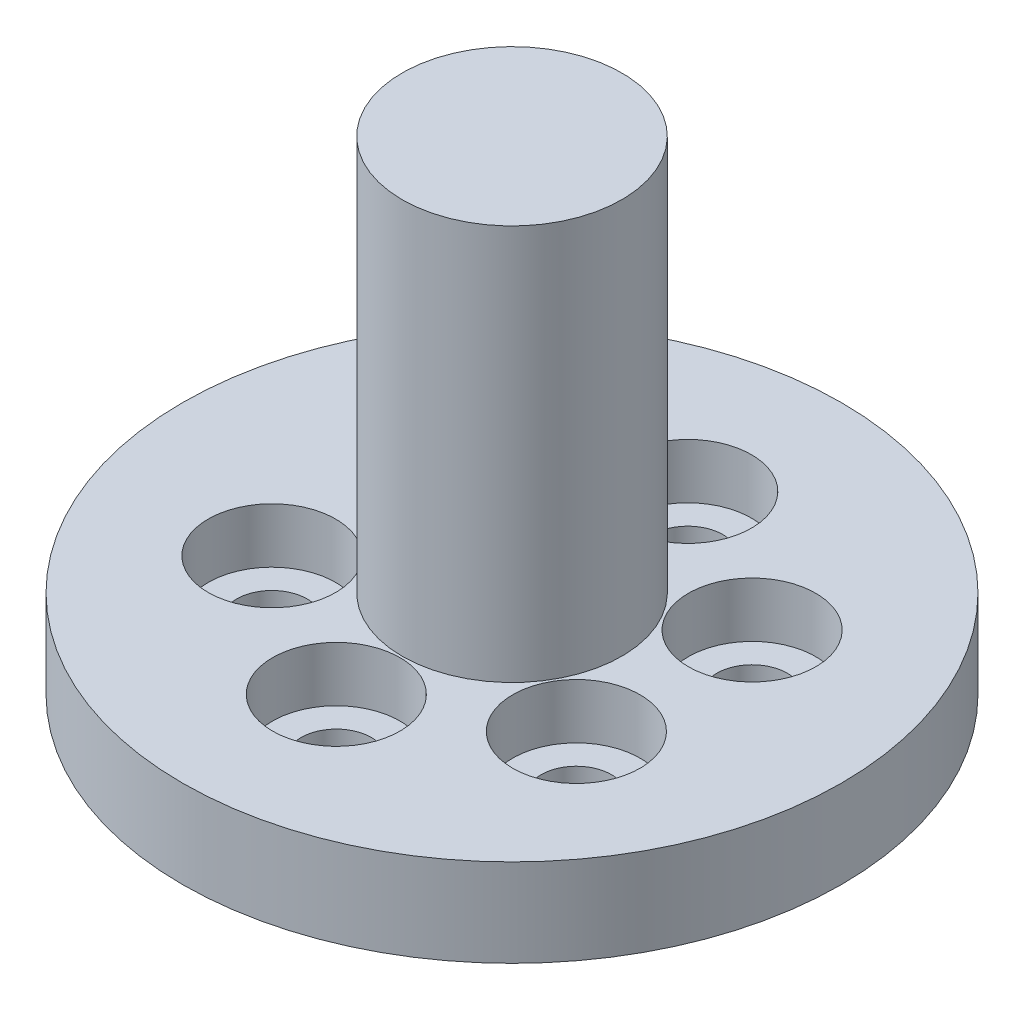
ISO-10303-21;
HEADER;
FILE_DESCRIPTION(('STEP AP214'),'2;1');
FILE_NAME('part.step','',(''),(''),'','','');
FILE_SCHEMA(('AUTOMOTIVE_DESIGN { 1 0 10303 214 1 1 1 1 }'));
ENDSEC;
DATA;
#1=APPLICATION_CONTEXT('core data for automotive mechanical design processes');
#2=APPLICATION_PROTOCOL_DEFINITION('international standard','automotive_design',2000,#1);
#3=PRODUCT_CONTEXT('',#1,'mechanical');
#4=PRODUCT('Part','Part','',(#3));
#5=PRODUCT_RELATED_PRODUCT_CATEGORY('part','',(#4));
#6=PRODUCT_DEFINITION_FORMATION('','',#4);
#7=PRODUCT_DEFINITION_CONTEXT('part definition',#1,'design');
#8=PRODUCT_DEFINITION('design','',#6,#7);
#9=PRODUCT_DEFINITION_SHAPE('','',#8);
#10=(LENGTH_UNIT() NAMED_UNIT(*) SI_UNIT(.MILLI.,.METRE.));
#11=(NAMED_UNIT(*) PLANE_ANGLE_UNIT() SI_UNIT($,.RADIAN.));
#12=(NAMED_UNIT(*) SI_UNIT($,.STERADIAN.) SOLID_ANGLE_UNIT());
#13=UNCERTAINTY_MEASURE_WITH_UNIT(LENGTH_MEASURE(1.E-05),#10,'distance_accuracy_value','');
#14=(GEOMETRIC_REPRESENTATION_CONTEXT(3) GLOBAL_UNCERTAINTY_ASSIGNED_CONTEXT((#13)) GLOBAL_UNIT_ASSIGNED_CONTEXT((#10,
#11,#12)) REPRESENTATION_CONTEXT('',''));
#15=CARTESIAN_POINT('',(0.,0.,0.));
#16=DIRECTION('',(0.,0.,1.));
#17=DIRECTION('',(1.,0.,0.));
#18=AXIS2_PLACEMENT_3D('',#15,#16,#17);
#19=CARTESIAN_POINT('',(6.92820323027568,-1.,-4.0000000000003));
#20=DIRECTION('',(0.,1.,0.));
#21=DIRECTION('',(0.,0.,1.));
#22=AXIS2_PLACEMENT_3D('',#19,#20,#21);
#23=CYLINDRICAL_SURFACE('',#22,1.6000000000001);
#24=CARTESIAN_POINT('',(6.92820323027568,0.,-4.0000000000003));
#25=DIRECTION('',(0.,1.,0.));
#26=DIRECTION('',(0.,0.,1.));
#27=AXIS2_PLACEMENT_3D('',#24,#25,#26);
#28=CIRCLE('',#27,1.6000000000001);
#29=CARTESIAN_POINT('',(6.92820323027568,0.,-2.4000000000002));
#30=VERTEX_POINT('',#29);
#31=EDGE_CURVE('E56',#30,#30,#28,.T.);
#32=ORIENTED_EDGE('',*,*,#31,.F.);
#33=EDGE_LOOP('',(#32));
#34=FACE_BOUND('',#33,.T.);
#35=CARTESIAN_POINT('',(6.92820323027568,1.5,-4.0000000000003));
#36=DIRECTION('',(0.,1.,0.));
#37=DIRECTION('',(0.,0.,1.));
#38=AXIS2_PLACEMENT_3D('',#35,#36,#37);
#39=CIRCLE('',#38,1.6000000000001);
#40=CARTESIAN_POINT('',(6.92820323027568,1.5,-2.4000000000002));
#41=VERTEX_POINT('',#40);
#42=EDGE_CURVE('E41',#41,#41,#39,.F.);
#43=ORIENTED_EDGE('',*,*,#42,.F.);
#44=EDGE_LOOP('',(#43));
#45=FACE_BOUND('',#44,.T.);
#46=ADVANCED_FACE('F37',(#34,#45),#23,.F.);
#47=CARTESIAN_POINT('',(6.92820323027602,-1.,3.9999999999997));
#48=DIRECTION('',(0.,1.,0.));
#49=DIRECTION('',(0.,0.,1.));
#50=AXIS2_PLACEMENT_3D('',#47,#48,#49);
#51=CYLINDRICAL_SURFACE('',#50,1.60000000000044);
#52=CARTESIAN_POINT('',(6.92820323027602,0.,3.9999999999997));
#53=DIRECTION('',(0.,1.,0.));
#54=DIRECTION('',(0.,0.,1.));
#55=AXIS2_PLACEMENT_3D('',#52,#53,#54);
#56=CIRCLE('',#55,1.60000000000044);
#57=CARTESIAN_POINT('',(6.92820323027602,0.,5.60000000000014));
#58=VERTEX_POINT('',#57);
#59=EDGE_CURVE('E59',#58,#58,#56,.T.);
#60=ORIENTED_EDGE('',*,*,#59,.F.);
#61=EDGE_LOOP('',(#60));
#62=FACE_BOUND('',#61,.T.);
#63=CARTESIAN_POINT('',(6.92820323027602,1.5,3.9999999999997));
#64=DIRECTION('',(0.,1.,0.));
#65=DIRECTION('',(0.,0.,1.));
#66=AXIS2_PLACEMENT_3D('',#63,#64,#65);
#67=CIRCLE('',#66,1.60000000000044);
#68=CARTESIAN_POINT('',(6.92820323027602,1.5,5.60000000000014));
#69=VERTEX_POINT('',#68);
#70=EDGE_CURVE('E85',#69,#69,#67,.F.);
#71=ORIENTED_EDGE('',*,*,#70,.F.);
#72=EDGE_LOOP('',(#71));
#73=FACE_BOUND('',#72,.T.);
#74=ADVANCED_FACE('F95',(#62,#73),#51,.F.);
#75=CARTESIAN_POINT('',(6.79181874011743E-13,-1.,8.));
#76=DIRECTION('',(0.,1.,0.));
#77=DIRECTION('',(0.,0.,1.));
#78=AXIS2_PLACEMENT_3D('',#75,#76,#77);
#79=CYLINDRICAL_SURFACE('',#78,1.6000000000007);
#80=CARTESIAN_POINT('',(6.79181874011743E-13,0.,8.));
#81=DIRECTION('',(0.,1.,0.));
#82=DIRECTION('',(0.,0.,1.));
#83=AXIS2_PLACEMENT_3D('',#80,#81,#82);
#84=CIRCLE('',#83,1.6000000000007);
#85=CARTESIAN_POINT('',(6.79181874011743E-13,0.,9.6000000000007));
#86=VERTEX_POINT('',#85);
#87=EDGE_CURVE('E62',#86,#86,#84,.T.);
#88=ORIENTED_EDGE('',*,*,#87,.F.);
#89=EDGE_LOOP('',(#88));
#90=FACE_BOUND('',#89,.T.);
#91=CARTESIAN_POINT('',(6.79181874011743E-13,1.5,8.));
#92=DIRECTION('',(0.,1.,0.));
#93=DIRECTION('',(0.,0.,1.));
#94=AXIS2_PLACEMENT_3D('',#91,#92,#93);
#95=CIRCLE('',#94,1.6000000000007);
#96=CARTESIAN_POINT('',(6.79181874011743E-13,1.5,9.6000000000007));
#97=VERTEX_POINT('',#96);
#98=EDGE_CURVE('E83',#97,#97,#95,.F.);
#99=ORIENTED_EDGE('',*,*,#98,.F.);
#100=EDGE_LOOP('',(#99));
#101=FACE_BOUND('',#100,.T.);
#102=ADVANCED_FACE('F101',(#90,#101),#79,.F.);
#103=CARTESIAN_POINT('',(-6.928203230275,-1.,4.0000000000003));
#104=DIRECTION('',(0.,1.,0.));
#105=DIRECTION('',(0.,0.,1.));
#106=AXIS2_PLACEMENT_3D('',#103,#104,#105);
#107=CYLINDRICAL_SURFACE('',#106,1.60000000000065);
#108=CARTESIAN_POINT('',(-6.928203230275,0.,4.0000000000003));
#109=DIRECTION('',(0.,1.,0.));
#110=DIRECTION('',(0.,0.,1.));
#111=AXIS2_PLACEMENT_3D('',#108,#109,#110);
#112=CIRCLE('',#111,1.60000000000065);
#113=CARTESIAN_POINT('',(-6.928203230275,0.,5.60000000000095));
#114=VERTEX_POINT('',#113);
#115=EDGE_CURVE('E65',#114,#114,#112,.T.);
#116=ORIENTED_EDGE('',*,*,#115,.F.);
#117=EDGE_LOOP('',(#116));
#118=FACE_BOUND('',#117,.T.);
#119=CARTESIAN_POINT('',(-6.928203230275,1.5,4.0000000000003));
#120=DIRECTION('',(0.,1.,0.));
#121=DIRECTION('',(0.,0.,1.));
#122=AXIS2_PLACEMENT_3D('',#119,#120,#121);
#123=CIRCLE('',#122,1.60000000000065);
#124=CARTESIAN_POINT('',(-6.928203230275,1.5,5.60000000000095));
#125=VERTEX_POINT('',#124);
#126=EDGE_CURVE('E80',#125,#125,#123,.F.);
#127=ORIENTED_EDGE('',*,*,#126,.F.);
#128=EDGE_LOOP('',(#127));
#129=FACE_BOUND('',#128,.T.);
#130=ADVANCED_FACE('F111',(#118,#129),#107,.F.);
#131=CARTESIAN_POINT('',(-6.92820323027534,-1.,-3.9999999999997));
#132=DIRECTION('',(0.,1.,0.));
#133=DIRECTION('',(0.,0.,1.));
#134=AXIS2_PLACEMENT_3D('',#131,#132,#133);
#135=CYLINDRICAL_SURFACE('',#134,1.60000000000034);
#136=CARTESIAN_POINT('',(-6.92820323027534,0.,-3.9999999999997));
#137=DIRECTION('',(0.,1.,0.));
#138=DIRECTION('',(0.,0.,1.));
#139=AXIS2_PLACEMENT_3D('',#136,#137,#138);
#140=CIRCLE('',#139,1.60000000000034);
#141=CARTESIAN_POINT('',(-6.92820323027534,0.,-2.39999999999936));
#142=VERTEX_POINT('',#141);
#143=EDGE_CURVE('E68',#142,#142,#140,.T.);
#144=ORIENTED_EDGE('',*,*,#143,.F.);
#145=EDGE_LOOP('',(#144));
#146=FACE_BOUND('',#145,.T.);
#147=CARTESIAN_POINT('',(-6.92820323027534,1.5,-3.9999999999997));
#148=DIRECTION('',(0.,1.,0.));
#149=DIRECTION('',(0.,0.,1.));
#150=AXIS2_PLACEMENT_3D('',#147,#148,#149);
#151=CIRCLE('',#150,1.60000000000034);
#152=CARTESIAN_POINT('',(-6.92820323027534,1.5,-2.39999999999936));
#153=VERTEX_POINT('',#152);
#154=EDGE_CURVE('E76',#153,#153,#151,.F.);
#155=ORIENTED_EDGE('',*,*,#154,.F.);
#156=EDGE_LOOP('',(#155));
#157=FACE_BOUND('',#156,.T.);
#158=ADVANCED_FACE('F106',(#146,#157),#135,.F.);
#159=CARTESIAN_POINT('',(0.,-1.,-8.));
#160=DIRECTION('',(0.,1.,0.));
#161=DIRECTION('',(0.,0.,1.));
#162=AXIS2_PLACEMENT_3D('',#159,#160,#161);
#163=CYLINDRICAL_SURFACE('',#162,1.6);
#164=CARTESIAN_POINT('',(0.,0.,-8.));
#165=DIRECTION('',(0.,1.,0.));
#166=DIRECTION('',(0.,0.,1.));
#167=AXIS2_PLACEMENT_3D('',#164,#165,#166);
#168=CIRCLE('',#167,1.6);
#169=CARTESIAN_POINT('',(0.,0.,-6.4));
#170=VERTEX_POINT('',#169);
#171=EDGE_CURVE('E50',#170,#170,#168,.T.);
#172=ORIENTED_EDGE('',*,*,#171,.F.);
#173=EDGE_LOOP('',(#172));
#174=FACE_BOUND('',#173,.T.);
#175=CARTESIAN_POINT('',(0.,1.5,-8.));
#176=DIRECTION('',(0.,1.,0.));
#177=DIRECTION('',(0.,0.,1.));
#178=AXIS2_PLACEMENT_3D('',#175,#176,#177);
#179=CIRCLE('',#178,1.6);
#180=CARTESIAN_POINT('',(0.,1.5,-6.4));
#181=VERTEX_POINT('',#180);
#182=EDGE_CURVE('E73',#181,#181,#179,.F.);
#183=ORIENTED_EDGE('',*,*,#182,.F.);
#184=EDGE_LOOP('',(#183));
#185=FACE_BOUND('',#184,.T.);
#186=ADVANCED_FACE('F147',(#174,#185),#163,.F.);
#187=CARTESIAN_POINT('',(0.,4.,0.));
#188=DIRECTION('',(0.,-1.,0.));
#189=DIRECTION('',(0.,0.,-1.));
#190=AXIS2_PLACEMENT_3D('',#187,#188,#189);
#191=CYLINDRICAL_SURFACE('',#190,15.);
#192=CARTESIAN_POINT('',(0.,4.,0.));
#193=DIRECTION('',(0.,1.,0.));
#194=DIRECTION('',(0.,0.,1.));
#195=AXIS2_PLACEMENT_3D('',#192,#193,#194);
#196=CIRCLE('',#195,15.);
#197=CARTESIAN_POINT('',(0.,4.,15.));
#198=VERTEX_POINT('',#197);
#199=EDGE_CURVE('E10',#198,#198,#196,.T.);
#200=ORIENTED_EDGE('',*,*,#199,.F.);
#201=EDGE_LOOP('',(#200));
#202=FACE_BOUND('',#201,.T.);
#203=CARTESIAN_POINT('',(0.,0.,0.));
#204=DIRECTION('',(0.,1.,0.));
#205=DIRECTION('',(0.,0.,1.));
#206=AXIS2_PLACEMENT_3D('',#203,#204,#205);
#207=CIRCLE('',#206,15.);
#208=CARTESIAN_POINT('',(0.,0.,15.));
#209=VERTEX_POINT('',#208);
#210=EDGE_CURVE('E45',#209,#209,#207,.T.);
#211=ORIENTED_EDGE('',*,*,#210,.T.);
#212=EDGE_LOOP('',(#211));
#213=FACE_BOUND('',#212,.T.);
#214=ADVANCED_FACE('F39',(#202,#213),#191,.T.);
#215=CARTESIAN_POINT('',(0.,4.,0.));
#216=DIRECTION('',(0.,1.,0.));
#217=DIRECTION('',(0.,0.,1.));
#218=AXIS2_PLACEMENT_3D('',#215,#216,#217);
#219=PLANE('',#218);
#220=CARTESIAN_POINT('',(0.,4.,0.));
#221=DIRECTION('',(0.,1.,0.));
#222=DIRECTION('',(0.,0.,1.));
#223=AXIS2_PLACEMENT_3D('',#220,#221,#222);
#224=CIRCLE('',#223,5.);
#225=CARTESIAN_POINT('',(0.,4.,5.));
#226=VERTEX_POINT('',#225);
#227=EDGE_CURVE('E221',#226,#226,#224,.T.);
#228=ORIENTED_EDGE('',*,*,#227,.F.);
#229=EDGE_LOOP('',(#228));
#230=FACE_BOUND('',#229,.T.);
#231=CARTESIAN_POINT('',(6.92870323027552,4.,-4.00086602540377));
#232=DIRECTION('',(0.,1.,0.));
#233=DIRECTION('',(0.,0.,1.));
#234=AXIS2_PLACEMENT_3D('',#231,#232,#233);
#235=CIRCLE('',#234,2.9);
#236=CARTESIAN_POINT('',(6.92870323027552,4.,-1.10086602540377));
#237=VERTEX_POINT('',#236);
#238=EDGE_CURVE('E240',#237,#237,#235,.T.);
#239=ORIENTED_EDGE('',*,*,#238,.F.);
#240=EDGE_LOOP('',(#239));
#241=FACE_BOUND('',#240,.T.);
#242=CARTESIAN_POINT('',(6.92970323027549,4.,3.99913397459625));
#243=DIRECTION('',(0.,1.,0.));
#244=DIRECTION('',(0.,0.,1.));
#245=AXIS2_PLACEMENT_3D('',#242,#243,#244);
#246=CIRCLE('',#245,2.9);
#247=CARTESIAN_POINT('',(6.92970323027549,4.,6.89913397459625));
#248=VERTEX_POINT('',#247);
#249=EDGE_CURVE('E246',#248,#248,#246,.T.);
#250=ORIENTED_EDGE('',*,*,#249,.F.);
#251=EDGE_LOOP('',(#250));
#252=FACE_BOUND('',#251,.T.);
#253=CARTESIAN_POINT('',(0.00199999999994414,4.,8.));
#254=DIRECTION('',(0.,1.,0.));
#255=DIRECTION('',(0.,0.,1.));
#256=AXIS2_PLACEMENT_3D('',#253,#254,#255);
#257=CIRCLE('',#256,2.9);
#258=CARTESIAN_POINT('',(0.00199999999994414,4.,10.9));
#259=VERTEX_POINT('',#258);
#260=EDGE_CURVE('E252',#259,#259,#257,.T.);
#261=ORIENTED_EDGE('',*,*,#260,.F.);
#262=EDGE_LOOP('',(#261));
#263=FACE_BOUND('',#262,.T.);
#264=CARTESIAN_POINT('',(-6.92670323027555,4.,4.00086602540372));
#265=DIRECTION('',(0.,1.,0.));
#266=DIRECTION('',(0.,0.,1.));
#267=AXIS2_PLACEMENT_3D('',#264,#265,#266);
#268=CIRCLE('',#267,2.9);
#269=CARTESIAN_POINT('',(-6.92670323027555,4.,6.90086602540372));
#270=VERTEX_POINT('',#269);
#271=EDGE_CURVE('E234',#270,#270,#268,.T.);
#272=ORIENTED_EDGE('',*,*,#271,.F.);
#273=EDGE_LOOP('',(#272));
#274=FACE_BOUND('',#273,.T.);
#275=CARTESIAN_POINT('',(-6.92770323027546,4.,-3.9991339745963));
#276=DIRECTION('',(0.,1.,0.));
#277=DIRECTION('',(0.,0.,1.));
#278=AXIS2_PLACEMENT_3D('',#275,#276,#277);
#279=CIRCLE('',#278,2.9);
#280=CARTESIAN_POINT('',(-6.92770323027546,4.,-1.0991339745963));
#281=VERTEX_POINT('',#280);
#282=EDGE_CURVE('E229',#281,#281,#279,.T.);
#283=ORIENTED_EDGE('',*,*,#282,.F.);
#284=EDGE_LOOP('',(#283));
#285=FACE_BOUND('',#284,.T.);
#286=CARTESIAN_POINT('',(0.,4.,-8.));
#287=DIRECTION('',(0.,1.,0.));
#288=DIRECTION('',(0.,0.,1.));
#289=AXIS2_PLACEMENT_3D('',#286,#287,#288);
#290=CIRCLE('',#289,2.9);
#291=CARTESIAN_POINT('',(0.,4.,-5.1));
#292=VERTEX_POINT('',#291);
#293=EDGE_CURVE('E53',#292,#292,#290,.T.);
#294=ORIENTED_EDGE('',*,*,#293,.F.);
#295=EDGE_LOOP('',(#294));
#296=FACE_BOUND('',#295,.T.);
#297=ORIENTED_EDGE('',*,*,#199,.T.);
#298=EDGE_LOOP('',(#297));
#299=FACE_BOUND('',#298,.T.);
#300=ADVANCED_FACE('F116',(#230,#241,#252,#263,#274,#285,#296,#299),#219,.T.);
#301=CARTESIAN_POINT('',(0.,0.,0.));
#302=DIRECTION('',(0.,1.,0.));
#303=DIRECTION('',(0.,0.,1.));
#304=AXIS2_PLACEMENT_3D('',#301,#302,#303);
#305=PLANE('',#304);
#306=CARTESIAN_POINT('',(0.,0.,0.));
#307=DIRECTION('',(0.,-1.,0.));
#308=DIRECTION('',(0.,0.,-1.));
#309=AXIS2_PLACEMENT_3D('',#306,#307,#308);
#310=CIRCLE('',#309,4.);
#311=CARTESIAN_POINT('',(0.,0.,-4.));
#312=VERTEX_POINT('',#311);
#313=EDGE_CURVE('E132',#312,#312,#310,.T.);
#314=ORIENTED_EDGE('',*,*,#313,.F.);
#315=EDGE_LOOP('',(#314));
#316=FACE_BOUND('',#315,.T.);
#317=ORIENTED_EDGE('',*,*,#171,.T.);
#318=EDGE_LOOP('',(#317));
#319=FACE_BOUND('',#318,.T.);
#320=ORIENTED_EDGE('',*,*,#143,.T.);
#321=EDGE_LOOP('',(#320));
#322=FACE_BOUND('',#321,.T.);
#323=ORIENTED_EDGE('',*,*,#115,.T.);
#324=EDGE_LOOP('',(#323));
#325=FACE_BOUND('',#324,.T.);
#326=ORIENTED_EDGE('',*,*,#87,.T.);
#327=EDGE_LOOP('',(#326));
#328=FACE_BOUND('',#327,.T.);
#329=ORIENTED_EDGE('',*,*,#59,.T.);
#330=EDGE_LOOP('',(#329));
#331=FACE_BOUND('',#330,.T.);
#332=ORIENTED_EDGE('',*,*,#31,.T.);
#333=EDGE_LOOP('',(#332));
#334=FACE_BOUND('',#333,.T.);
#335=ORIENTED_EDGE('',*,*,#210,.F.);
#336=EDGE_LOOP('',(#335));
#337=FACE_BOUND('',#336,.T.);
#338=ADVANCED_FACE('F118',(#316,#319,#322,#325,#328,#331,#334,#337),#305,.F.);
#339=CARTESIAN_POINT('',(0.,1.5,-8.));
#340=DIRECTION('',(0.,1.,0.));
#341=DIRECTION('',(0.,0.,1.));
#342=AXIS2_PLACEMENT_3D('',#339,#340,#341);
#343=PLANE('',#342);
#344=CARTESIAN_POINT('',(0.,1.5,-8.));
#345=DIRECTION('',(0.,1.,0.));
#346=DIRECTION('',(0.,0.,1.));
#347=AXIS2_PLACEMENT_3D('',#344,#345,#346);
#348=CIRCLE('',#347,2.9);
#349=CARTESIAN_POINT('',(0.,1.5,-5.1));
#350=VERTEX_POINT('',#349);
#351=EDGE_CURVE('E77',#350,#350,#348,.T.);
#352=ORIENTED_EDGE('',*,*,#351,.T.);
#353=EDGE_LOOP('',(#352));
#354=FACE_BOUND('',#353,.T.);
#355=ORIENTED_EDGE('',*,*,#182,.T.);
#356=EDGE_LOOP('',(#355));
#357=FACE_BOUND('',#356,.T.);
#358=ADVANCED_FACE('F121',(#354,#357),#343,.T.);
#359=CARTESIAN_POINT('',(0.,1.5,-8.));
#360=DIRECTION('',(0.,1.,0.));
#361=DIRECTION('',(0.,0.,1.));
#362=AXIS2_PLACEMENT_3D('',#359,#360,#361);
#363=CYLINDRICAL_SURFACE('',#362,2.9);
#364=ORIENTED_EDGE('',*,*,#351,.F.);
#365=EDGE_LOOP('',(#364));
#366=FACE_BOUND('',#365,.T.);
#367=ORIENTED_EDGE('',*,*,#293,.T.);
#368=EDGE_LOOP('',(#367));
#369=FACE_BOUND('',#368,.T.);
#370=ADVANCED_FACE('F126',(#366,#369),#363,.F.);
#371=CARTESIAN_POINT('',(-6.92770323027546,1.5,-3.9991339745963));
#372=DIRECTION('',(0.,1.,0.));
#373=DIRECTION('',(0.,0.,1.));
#374=AXIS2_PLACEMENT_3D('',#371,#372,#373);
#375=PLANE('',#374);
#376=CARTESIAN_POINT('',(-6.92770323027546,1.5,-3.9991339745963));
#377=DIRECTION('',(0.,1.,0.));
#378=DIRECTION('',(0.,0.,1.));
#379=AXIS2_PLACEMENT_3D('',#376,#377,#378);
#380=CIRCLE('',#379,2.9);
#381=CARTESIAN_POINT('',(-6.92770323027546,1.5,-1.0991339745963));
#382=VERTEX_POINT('',#381);
#383=EDGE_CURVE('E231',#382,#382,#380,.T.);
#384=ORIENTED_EDGE('',*,*,#383,.T.);
#385=EDGE_LOOP('',(#384));
#386=FACE_BOUND('',#385,.T.);
#387=ORIENTED_EDGE('',*,*,#154,.T.);
#388=EDGE_LOOP('',(#387));
#389=FACE_BOUND('',#388,.T.);
#390=ADVANCED_FACE('F160',(#386,#389),#375,.T.);
#391=CARTESIAN_POINT('',(-6.92770323027546,1.5,-3.9991339745963));
#392=DIRECTION('',(0.,1.,0.));
#393=DIRECTION('',(0.,0.,1.));
#394=AXIS2_PLACEMENT_3D('',#391,#392,#393);
#395=CYLINDRICAL_SURFACE('',#394,2.9);
#396=ORIENTED_EDGE('',*,*,#383,.F.);
#397=EDGE_LOOP('',(#396));
#398=FACE_BOUND('',#397,.T.);
#399=ORIENTED_EDGE('',*,*,#282,.T.);
#400=EDGE_LOOP('',(#399));
#401=FACE_BOUND('',#400,.T.);
#402=ADVANCED_FACE('F171',(#398,#401),#395,.F.);
#403=CARTESIAN_POINT('',(-6.92670323027555,1.5,4.00086602540372));
#404=DIRECTION('',(0.,1.,0.));
#405=DIRECTION('',(0.,0.,1.));
#406=AXIS2_PLACEMENT_3D('',#403,#404,#405);
#407=PLANE('',#406);
#408=CARTESIAN_POINT('',(-6.92670323027555,1.5,4.00086602540372));
#409=DIRECTION('',(0.,1.,0.));
#410=DIRECTION('',(0.,0.,1.));
#411=AXIS2_PLACEMENT_3D('',#408,#409,#410);
#412=CIRCLE('',#411,2.9);
#413=CARTESIAN_POINT('',(-6.92670323027555,1.5,6.90086602540372));
#414=VERTEX_POINT('',#413);
#415=EDGE_CURVE('E255',#414,#414,#412,.T.);
#416=ORIENTED_EDGE('',*,*,#415,.T.);
#417=EDGE_LOOP('',(#416));
#418=FACE_BOUND('',#417,.T.);
#419=ORIENTED_EDGE('',*,*,#126,.T.);
#420=EDGE_LOOP('',(#419));
#421=FACE_BOUND('',#420,.T.);
#422=ADVANCED_FACE('F167',(#418,#421),#407,.T.);
#423=CARTESIAN_POINT('',(-6.92670323027555,1.5,4.00086602540372));
#424=DIRECTION('',(0.,1.,0.));
#425=DIRECTION('',(0.,0.,1.));
#426=AXIS2_PLACEMENT_3D('',#423,#424,#425);
#427=CYLINDRICAL_SURFACE('',#426,2.9);
#428=ORIENTED_EDGE('',*,*,#415,.F.);
#429=EDGE_LOOP('',(#428));
#430=FACE_BOUND('',#429,.T.);
#431=ORIENTED_EDGE('',*,*,#271,.T.);
#432=EDGE_LOOP('',(#431));
#433=FACE_BOUND('',#432,.T.);
#434=ADVANCED_FACE('F163',(#430,#433),#427,.F.);
#435=CARTESIAN_POINT('',(0.00199999999994414,1.5,8.));
#436=DIRECTION('',(0.,1.,0.));
#437=DIRECTION('',(0.,0.,1.));
#438=AXIS2_PLACEMENT_3D('',#435,#436,#437);
#439=PLANE('',#438);
#440=CARTESIAN_POINT('',(0.00199999999994414,1.5,8.));
#441=DIRECTION('',(0.,1.,0.));
#442=DIRECTION('',(0.,0.,1.));
#443=AXIS2_PLACEMENT_3D('',#440,#441,#442);
#444=CIRCLE('',#443,2.9);
#445=CARTESIAN_POINT('',(0.00199999999994414,1.5,10.9));
#446=VERTEX_POINT('',#445);
#447=EDGE_CURVE('E249',#446,#446,#444,.T.);
#448=ORIENTED_EDGE('',*,*,#447,.T.);
#449=EDGE_LOOP('',(#448));
#450=FACE_BOUND('',#449,.T.);
#451=ORIENTED_EDGE('',*,*,#98,.T.);
#452=EDGE_LOOP('',(#451));
#453=FACE_BOUND('',#452,.T.);
#454=ADVANCED_FACE('F166',(#450,#453),#439,.T.);
#455=CARTESIAN_POINT('',(0.00199999999994414,1.5,8.));
#456=DIRECTION('',(0.,1.,0.));
#457=DIRECTION('',(0.,0.,1.));
#458=AXIS2_PLACEMENT_3D('',#455,#456,#457);
#459=CYLINDRICAL_SURFACE('',#458,2.9);
#460=ORIENTED_EDGE('',*,*,#447,.F.);
#461=EDGE_LOOP('',(#460));
#462=FACE_BOUND('',#461,.T.);
#463=ORIENTED_EDGE('',*,*,#260,.T.);
#464=EDGE_LOOP('',(#463));
#465=FACE_BOUND('',#464,.T.);
#466=ADVANCED_FACE('F173',(#462,#465),#459,.F.);
#467=CARTESIAN_POINT('',(6.92970323027549,1.5,3.99913397459625));
#468=DIRECTION('',(0.,1.,0.));
#469=DIRECTION('',(0.,0.,1.));
#470=AXIS2_PLACEMENT_3D('',#467,#468,#469);
#471=PLANE('',#470);
#472=CARTESIAN_POINT('',(6.92970323027549,1.5,3.99913397459625));
#473=DIRECTION('',(0.,1.,0.));
#474=DIRECTION('',(0.,0.,1.));
#475=AXIS2_PLACEMENT_3D('',#472,#473,#474);
#476=CIRCLE('',#475,2.9);
#477=CARTESIAN_POINT('',(6.92970323027549,1.5,6.89913397459625));
#478=VERTEX_POINT('',#477);
#479=EDGE_CURVE('E243',#478,#478,#476,.T.);
#480=ORIENTED_EDGE('',*,*,#479,.T.);
#481=EDGE_LOOP('',(#480));
#482=FACE_BOUND('',#481,.T.);
#483=ORIENTED_EDGE('',*,*,#70,.T.);
#484=EDGE_LOOP('',(#483));
#485=FACE_BOUND('',#484,.T.);
#486=ADVANCED_FACE('F176',(#482,#485),#471,.T.);
#487=CARTESIAN_POINT('',(6.92970323027549,1.5,3.99913397459625));
#488=DIRECTION('',(0.,1.,0.));
#489=DIRECTION('',(0.,0.,1.));
#490=AXIS2_PLACEMENT_3D('',#487,#488,#489);
#491=CYLINDRICAL_SURFACE('',#490,2.9);
#492=ORIENTED_EDGE('',*,*,#479,.F.);
#493=EDGE_LOOP('',(#492));
#494=FACE_BOUND('',#493,.T.);
#495=ORIENTED_EDGE('',*,*,#249,.T.);
#496=EDGE_LOOP('',(#495));
#497=FACE_BOUND('',#496,.T.);
#498=ADVANCED_FACE('F181',(#494,#497),#491,.F.);
#499=CARTESIAN_POINT('',(6.92870323027552,1.5,-4.00086602540377));
#500=DIRECTION('',(0.,1.,0.));
#501=DIRECTION('',(0.,0.,1.));
#502=AXIS2_PLACEMENT_3D('',#499,#500,#501);
#503=PLANE('',#502);
#504=CARTESIAN_POINT('',(6.92870323027552,1.5,-4.00086602540377));
#505=DIRECTION('',(0.,1.,0.));
#506=DIRECTION('',(0.,0.,1.));
#507=AXIS2_PLACEMENT_3D('',#504,#505,#506);
#508=CIRCLE('',#507,2.9);
#509=CARTESIAN_POINT('',(6.92870323027552,1.5,-1.10086602540377));
#510=VERTEX_POINT('',#509);
#511=EDGE_CURVE('E237',#510,#510,#508,.T.);
#512=ORIENTED_EDGE('',*,*,#511,.T.);
#513=EDGE_LOOP('',(#512));
#514=FACE_BOUND('',#513,.T.);
#515=ORIENTED_EDGE('',*,*,#42,.T.);
#516=EDGE_LOOP('',(#515));
#517=FACE_BOUND('',#516,.T.);
#518=ADVANCED_FACE('F92',(#514,#517),#503,.T.);
#519=CARTESIAN_POINT('',(6.92870323027552,1.5,-4.00086602540377));
#520=DIRECTION('',(0.,1.,0.));
#521=DIRECTION('',(0.,0.,1.));
#522=AXIS2_PLACEMENT_3D('',#519,#520,#521);
#523=CYLINDRICAL_SURFACE('',#522,2.9);
#524=ORIENTED_EDGE('',*,*,#511,.F.);
#525=EDGE_LOOP('',(#524));
#526=FACE_BOUND('',#525,.T.);
#527=ORIENTED_EDGE('',*,*,#238,.T.);
#528=EDGE_LOOP('',(#527));
#529=FACE_BOUND('',#528,.T.);
#530=ADVANCED_FACE('F188',(#526,#529),#523,.F.);
#531=CARTESIAN_POINT('',(0.,22.,0.));
#532=DIRECTION('',(0.,-1.,0.));
#533=DIRECTION('',(0.,0.,-1.));
#534=AXIS2_PLACEMENT_3D('',#531,#532,#533);
#535=CYLINDRICAL_SURFACE('',#534,5.);
#536=CARTESIAN_POINT('',(0.,22.,0.));
#537=DIRECTION('',(0.,1.,0.));
#538=DIRECTION('',(0.,0.,1.));
#539=AXIS2_PLACEMENT_3D('',#536,#537,#538);
#540=CIRCLE('',#539,5.);
#541=CARTESIAN_POINT('',(0.,22.,5.));
#542=VERTEX_POINT('',#541);
#543=EDGE_CURVE('E224',#542,#542,#540,.T.);
#544=ORIENTED_EDGE('',*,*,#543,.F.);
#545=EDGE_LOOP('',(#544));
#546=FACE_BOUND('',#545,.T.);
#547=ORIENTED_EDGE('',*,*,#227,.T.);
#548=EDGE_LOOP('',(#547));
#549=FACE_BOUND('',#548,.T.);
#550=ADVANCED_FACE('F191',(#546,#549),#535,.T.);
#551=CARTESIAN_POINT('',(0.,22.,0.));
#552=DIRECTION('',(0.,1.,0.));
#553=DIRECTION('',(0.,0.,1.));
#554=AXIS2_PLACEMENT_3D('',#551,#552,#553);
#555=PLANE('',#554);
#556=ORIENTED_EDGE('',*,*,#543,.T.);
#557=EDGE_LOOP('',(#556));
#558=FACE_BOUND('',#557,.T.);
#559=ADVANCED_FACE('F204',(#558),#555,.T.);
#560=CARTESIAN_POINT('',(0.,2.,0.));
#561=DIRECTION('',(0.,-1.,0.));
#562=DIRECTION('',(0.,0.,-1.));
#563=AXIS2_PLACEMENT_3D('',#560,#561,#562);
#564=CYLINDRICAL_SURFACE('',#563,4.);
#565=CARTESIAN_POINT('',(0.,2.,0.));
#566=DIRECTION('',(0.,-1.,0.));
#567=DIRECTION('',(0.,0.,-1.));
#568=AXIS2_PLACEMENT_3D('',#565,#566,#567);
#569=CIRCLE('',#568,4.);
#570=CARTESIAN_POINT('',(0.,2.,-4.));
#571=VERTEX_POINT('',#570);
#572=EDGE_CURVE('E220',#571,#571,#569,.T.);
#573=ORIENTED_EDGE('',*,*,#572,.F.);
#574=EDGE_LOOP('',(#573));
#575=FACE_BOUND('',#574,.T.);
#576=ORIENTED_EDGE('',*,*,#313,.T.);
#577=EDGE_LOOP('',(#576));
#578=FACE_BOUND('',#577,.T.);
#579=ADVANCED_FACE('F208',(#575,#578),#564,.F.);
#580=CARTESIAN_POINT('',(0.,2.,0.));
#581=DIRECTION('',(0.,-1.,0.));
#582=DIRECTION('',(0.,0.,-1.));
#583=AXIS2_PLACEMENT_3D('',#580,#581,#582);
#584=PLANE('',#583);
#585=ORIENTED_EDGE('',*,*,#572,.T.);
#586=EDGE_LOOP('',(#585));
#587=FACE_BOUND('',#586,.T.);
#588=ADVANCED_FACE('F212',(#587),#584,.T.);
#589=CLOSED_SHELL('',(#46,#74,#102,#130,#158,#186,#214,#300,#338,#358,#370,#390,#402,#422,#434,
#454,#466,#486,#498,#518,#530,#550,#559,#579,#588));
#590=MANIFOLD_SOLID_BREP('B2',#589);
#591=ADVANCED_BREP_SHAPE_REPRESENTATION('',(#18,#590),#14);
#592=SHAPE_DEFINITION_REPRESENTATION(#9,#591);
ENDSEC;
END-ISO-10303-21;
